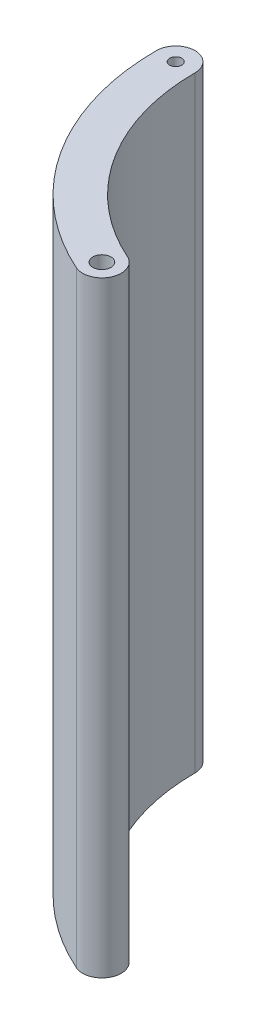
ISO-10303-21;
HEADER;
FILE_DESCRIPTION(('STEP AP214'),'2;1');
FILE_NAME('part.step','',(''),(''),'','','');
FILE_SCHEMA(('AUTOMOTIVE_DESIGN { 1 0 10303 214 1 1 1 1 }'));
ENDSEC;
DATA;
#1=APPLICATION_CONTEXT('core data for automotive mechanical design processes');
#2=APPLICATION_PROTOCOL_DEFINITION('international standard','automotive_design',2000,#1);
#3=PRODUCT_CONTEXT('',#1,'mechanical');
#4=PRODUCT('Part','Part','',(#3));
#5=PRODUCT_RELATED_PRODUCT_CATEGORY('part','',(#4));
#6=PRODUCT_DEFINITION_FORMATION('','',#4);
#7=PRODUCT_DEFINITION_CONTEXT('part definition',#1,'design');
#8=PRODUCT_DEFINITION('design','',#6,#7);
#9=PRODUCT_DEFINITION_SHAPE('','',#8);
#10=(LENGTH_UNIT() NAMED_UNIT(*) SI_UNIT(.MILLI.,.METRE.));
#11=(NAMED_UNIT(*) PLANE_ANGLE_UNIT() SI_UNIT($,.RADIAN.));
#12=(NAMED_UNIT(*) SI_UNIT($,.STERADIAN.) SOLID_ANGLE_UNIT());
#13=UNCERTAINTY_MEASURE_WITH_UNIT(LENGTH_MEASURE(1.E-05),#10,'distance_accuracy_value','');
#14=(GEOMETRIC_REPRESENTATION_CONTEXT(3) GLOBAL_UNCERTAINTY_ASSIGNED_CONTEXT((#13)) GLOBAL_UNIT_ASSIGNED_CONTEXT((#10,
#11,#12)) REPRESENTATION_CONTEXT('',''));
#15=CARTESIAN_POINT('',(0.,0.,0.));
#16=DIRECTION('',(0.,0.,1.));
#17=DIRECTION('',(1.,0.,0.));
#18=AXIS2_PLACEMENT_3D('',#15,#16,#17);
#19=CARTESIAN_POINT('',(-19.,100.,0.));
#20=DIRECTION('',(0.,-1.,0.));
#21=DIRECTION('',(0.,0.,-1.));
#22=AXIS2_PLACEMENT_3D('',#19,#20,#21);
#23=PLANE('',#22);
#24=CARTESIAN_POINT('',(-38.,100.,0.));
#25=DIRECTION('',(0.,1.,0.));
#26=DIRECTION('',(0.,0.,-1.));
#27=AXIS2_PLACEMENT_3D('',#24,#25,#26);
#28=CIRCLE('',#27,3.18);
#29=CARTESIAN_POINT('',(-34.82,100.,0.));
#30=VERTEX_POINT('',#29);
#31=CARTESIAN_POINT('',(-41.18,100.,0.));
#32=VERTEX_POINT('',#31);
#33=EDGE_CURVE('E92',#30,#32,#28,.T.);
#34=ORIENTED_EDGE('',*,*,#33,.T.);
#35=CARTESIAN_POINT('',(0.,100.,0.));
#36=DIRECTION('',(0.,1.,0.));
#37=DIRECTION('',(0.,0.,1.));
#38=AXIS2_PLACEMENT_3D('',#35,#36,#37);
#39=CIRCLE('',#38,41.18);
#40=CARTESIAN_POINT('',(-16.7494149618614,100.,37.6198019457224));
#41=VERTEX_POINT('',#40);
#42=EDGE_CURVE('E87',#32,#41,#39,.T.);
#43=ORIENTED_EDGE('',*,*,#42,.T.);
#44=CARTESIAN_POINT('',(-15.4559924368803,100.,34.7147273904189));
#45=DIRECTION('',(0.,1.,0.));
#46=DIRECTION('',(0.,0.,-1.));
#47=AXIS2_PLACEMENT_3D('',#44,#45,#46);
#48=CIRCLE('',#47,3.18);
#49=CARTESIAN_POINT('',(-14.1625699118993,100.,31.8096528351154));
#50=VERTEX_POINT('',#49);
#51=EDGE_CURVE('E90',#41,#50,#48,.T.);
#52=ORIENTED_EDGE('',*,*,#51,.T.);
#53=CARTESIAN_POINT('',(0.,100.,0.));
#54=DIRECTION('',(0.,-1.,0.));
#55=DIRECTION('',(0.,0.,1.));
#56=AXIS2_PLACEMENT_3D('',#53,#54,#55);
#57=CIRCLE('',#56,34.82);
#58=EDGE_CURVE('E57',#50,#30,#57,.T.);
#59=ORIENTED_EDGE('',*,*,#58,.T.);
#60=EDGE_LOOP('',(#34,#43,#52,#59));
#61=FACE_BOUND('',#60,.T.);
#62=CARTESIAN_POINT('',(-15.4559924368803,100.,34.7147273904189));
#63=DIRECTION('',(0.,1.,0.));
#64=DIRECTION('',(0.,0.,1.));
#65=AXIS2_PLACEMENT_3D('',#62,#63,#64);
#66=CIRCLE('',#65,1.5);
#67=CARTESIAN_POINT('',(-15.4559924368803,100.,36.2147273904189));
#68=VERTEX_POINT('',#67);
#69=EDGE_CURVE('E112',#68,#68,#66,.T.);
#70=ORIENTED_EDGE('',*,*,#69,.F.);
#71=EDGE_LOOP('',(#70));
#72=FACE_BOUND('',#71,.T.);
#73=CARTESIAN_POINT('',(-38.,100.,0.));
#74=DIRECTION('',(0.,1.,0.));
#75=DIRECTION('',(0.,0.,1.));
#76=AXIS2_PLACEMENT_3D('',#73,#74,#75);
#77=CIRCLE('',#76,0.999999999999998);
#78=CARTESIAN_POINT('',(-38.,100.,0.999999999999998));
#79=VERTEX_POINT('',#78);
#80=EDGE_CURVE('E134',#79,#79,#77,.T.);
#81=ORIENTED_EDGE('',*,*,#80,.F.);
#82=EDGE_LOOP('',(#81));
#83=FACE_BOUND('',#82,.T.);
#84=ADVANCED_FACE('F39',(#61,#72,#83),#23,.F.);
#85=CARTESIAN_POINT('',(-19.,0.,0.));
#86=DIRECTION('',(0.,-1.,0.));
#87=DIRECTION('',(0.,0.,-1.));
#88=AXIS2_PLACEMENT_3D('',#85,#86,#87);
#89=PLANE('',#88);
#90=CARTESIAN_POINT('',(-15.4559924368803,0.,34.7147273904189));
#91=DIRECTION('',(0.,1.,0.));
#92=DIRECTION('',(0.,0.,1.));
#93=AXIS2_PLACEMENT_3D('',#90,#91,#92);
#94=CIRCLE('',#93,1.5);
#95=CARTESIAN_POINT('',(-15.4559924368803,0.,36.2147273904189));
#96=VERTEX_POINT('',#95);
#97=EDGE_CURVE('E130',#96,#96,#94,.T.);
#98=ORIENTED_EDGE('',*,*,#97,.T.);
#99=EDGE_LOOP('',(#98));
#100=FACE_BOUND('',#99,.T.);
#101=CARTESIAN_POINT('',(-38.,0.,0.));
#102=DIRECTION('',(0.,1.,0.));
#103=DIRECTION('',(0.,0.,-1.));
#104=AXIS2_PLACEMENT_3D('',#101,#102,#103);
#105=CIRCLE('',#104,3.18);
#106=CARTESIAN_POINT('',(-34.82,0.,0.));
#107=VERTEX_POINT('',#106);
#108=CARTESIAN_POINT('',(-41.18,0.,0.));
#109=VERTEX_POINT('',#108);
#110=EDGE_CURVE('E108',#107,#109,#105,.T.);
#111=ORIENTED_EDGE('',*,*,#110,.F.);
#112=CARTESIAN_POINT('',(0.,0.,0.));
#113=DIRECTION('',(0.,-1.,0.));
#114=DIRECTION('',(0.,0.,1.));
#115=AXIS2_PLACEMENT_3D('',#112,#113,#114);
#116=CIRCLE('',#115,34.82);
#117=CARTESIAN_POINT('',(-14.1625699118993,0.,31.8096528351154));
#118=VERTEX_POINT('',#117);
#119=EDGE_CURVE('E80',#118,#107,#116,.T.);
#120=ORIENTED_EDGE('',*,*,#119,.F.);
#121=CARTESIAN_POINT('',(-15.4559924368803,0.,34.7147273904189));
#122=DIRECTION('',(0.,1.,0.));
#123=DIRECTION('',(0.,0.,-1.));
#124=AXIS2_PLACEMENT_3D('',#121,#122,#123);
#125=CIRCLE('',#124,3.18);
#126=CARTESIAN_POINT('',(-16.7494149618614,0.,37.6198019457224));
#127=VERTEX_POINT('',#126);
#128=EDGE_CURVE('E74',#127,#118,#125,.T.);
#129=ORIENTED_EDGE('',*,*,#128,.F.);
#130=CARTESIAN_POINT('',(0.,0.,0.));
#131=DIRECTION('',(0.,1.,0.));
#132=DIRECTION('',(0.,0.,1.));
#133=AXIS2_PLACEMENT_3D('',#130,#131,#132);
#134=CIRCLE('',#133,41.18);
#135=EDGE_CURVE('E97',#109,#127,#134,.T.);
#136=ORIENTED_EDGE('',*,*,#135,.F.);
#137=EDGE_LOOP('',(#111,#120,#129,#136));
#138=FACE_BOUND('',#137,.T.);
#139=CARTESIAN_POINT('',(-38.,0.,0.));
#140=DIRECTION('',(0.,1.,0.));
#141=DIRECTION('',(0.,0.,1.));
#142=AXIS2_PLACEMENT_3D('',#139,#140,#141);
#143=CIRCLE('',#142,0.999999999999998);
#144=CARTESIAN_POINT('',(-38.,0.,0.999999999999998));
#145=VERTEX_POINT('',#144);
#146=EDGE_CURVE('E138',#145,#145,#143,.T.);
#147=ORIENTED_EDGE('',*,*,#146,.T.);
#148=EDGE_LOOP('',(#147));
#149=FACE_BOUND('',#148,.T.);
#150=ADVANCED_FACE('F125',(#100,#138,#149),#89,.T.);
#151=CARTESIAN_POINT('',(-38.,100.,0.));
#152=DIRECTION('',(0.,-1.,0.));
#153=DIRECTION('',(0.,0.,-1.));
#154=AXIS2_PLACEMENT_3D('',#151,#152,#153);
#155=CYLINDRICAL_SURFACE('',#154,3.18);
#156=ORIENTED_EDGE('',*,*,#110,.T.);
#157=DIRECTION('',(0.,-1.,0.));
#158=VECTOR('',#157,1.);
#159=CARTESIAN_POINT('',(-41.18,100.,0.));
#160=LINE('',#159,#158);
#161=EDGE_CURVE('E11',#32,#109,#160,.T.);
#162=ORIENTED_EDGE('',*,*,#161,.F.);
#163=ORIENTED_EDGE('',*,*,#33,.F.);
#164=DIRECTION('',(0.,-1.,0.));
#165=VECTOR('',#164,1.);
#166=CARTESIAN_POINT('',(-34.82,100.,0.));
#167=LINE('',#166,#165);
#168=EDGE_CURVE('E104',#30,#107,#167,.T.);
#169=ORIENTED_EDGE('',*,*,#168,.T.);
#170=EDGE_LOOP('',(#156,#162,#163,#169));
#171=FACE_BOUND('',#170,.T.);
#172=ADVANCED_FACE('F41',(#171),#155,.T.);
#173=CARTESIAN_POINT('',(0.,100.,0.));
#174=DIRECTION('',(0.,-1.,0.));
#175=DIRECTION('',(0.,0.,-1.));
#176=AXIS2_PLACEMENT_3D('',#173,#174,#175);
#177=CYLINDRICAL_SURFACE('',#176,41.18);
#178=ORIENTED_EDGE('',*,*,#135,.T.);
#179=DIRECTION('',(0.,-1.,0.));
#180=VECTOR('',#179,1.);
#181=CARTESIAN_POINT('',(-16.7494149618614,100.,37.6198019457224));
#182=LINE('',#181,#180);
#183=EDGE_CURVE('E49',#41,#127,#182,.T.);
#184=ORIENTED_EDGE('',*,*,#183,.F.);
#185=ORIENTED_EDGE('',*,*,#42,.F.);
#186=ORIENTED_EDGE('',*,*,#161,.T.);
#187=EDGE_LOOP('',(#178,#184,#185,#186));
#188=FACE_BOUND('',#187,.T.);
#189=ADVANCED_FACE('F96',(#188),#177,.T.);
#190=CARTESIAN_POINT('',(-15.4559924368803,100.,34.7147273904189));
#191=DIRECTION('',(0.,-1.,0.));
#192=DIRECTION('',(0.,0.,-1.));
#193=AXIS2_PLACEMENT_3D('',#190,#191,#192);
#194=CYLINDRICAL_SURFACE('',#193,3.18);
#195=ORIENTED_EDGE('',*,*,#128,.T.);
#196=DIRECTION('',(0.,-1.,0.));
#197=VECTOR('',#196,1.);
#198=CARTESIAN_POINT('',(-14.1625699118993,100.,31.8096528351154));
#199=LINE('',#198,#197);
#200=EDGE_CURVE('E99',#50,#118,#199,.T.);
#201=ORIENTED_EDGE('',*,*,#200,.F.);
#202=ORIENTED_EDGE('',*,*,#51,.F.);
#203=ORIENTED_EDGE('',*,*,#183,.T.);
#204=EDGE_LOOP('',(#195,#201,#202,#203));
#205=FACE_BOUND('',#204,.T.);
#206=ADVANCED_FACE('F100',(#205),#194,.T.);
#207=CARTESIAN_POINT('',(0.,100.,0.));
#208=DIRECTION('',(0.,-1.,0.));
#209=DIRECTION('',(0.,0.,-1.));
#210=AXIS2_PLACEMENT_3D('',#207,#208,#209);
#211=CYLINDRICAL_SURFACE('',#210,34.82);
#212=ORIENTED_EDGE('',*,*,#119,.T.);
#213=ORIENTED_EDGE('',*,*,#168,.F.);
#214=ORIENTED_EDGE('',*,*,#58,.F.);
#215=ORIENTED_EDGE('',*,*,#200,.T.);
#216=EDGE_LOOP('',(#212,#213,#214,#215));
#217=FACE_BOUND('',#216,.T.);
#218=ADVANCED_FACE('F122',(#217),#211,.F.);
#219=CARTESIAN_POINT('',(-15.4559924368803,100.,34.7147273904189));
#220=DIRECTION('',(0.,-1.,0.));
#221=DIRECTION('',(0.,0.,-1.));
#222=AXIS2_PLACEMENT_3D('',#219,#220,#221);
#223=CYLINDRICAL_SURFACE('',#222,1.5);
#224=ORIENTED_EDGE('',*,*,#69,.T.);
#225=EDGE_LOOP('',(#224));
#226=FACE_BOUND('',#225,.T.);
#227=ORIENTED_EDGE('',*,*,#97,.F.);
#228=EDGE_LOOP('',(#227));
#229=FACE_BOUND('',#228,.T.);
#230=ADVANCED_FACE('F157',(#226,#229),#223,.F.);
#231=CARTESIAN_POINT('',(-38.,100.,0.));
#232=DIRECTION('',(0.,-1.,0.));
#233=DIRECTION('',(0.,0.,-1.));
#234=AXIS2_PLACEMENT_3D('',#231,#232,#233);
#235=CYLINDRICAL_SURFACE('',#234,0.999999999999998);
#236=ORIENTED_EDGE('',*,*,#80,.T.);
#237=EDGE_LOOP('',(#236));
#238=FACE_BOUND('',#237,.T.);
#239=ORIENTED_EDGE('',*,*,#146,.F.);
#240=EDGE_LOOP('',(#239));
#241=FACE_BOUND('',#240,.T.);
#242=ADVANCED_FACE('F146',(#238,#241),#235,.F.);
#243=CLOSED_SHELL('',(#84,#150,#172,#189,#206,#218,#230,#242));
#244=MANIFOLD_SOLID_BREP('B2',#243);
#245=ADVANCED_BREP_SHAPE_REPRESENTATION('',(#18,#244),#14);
#246=SHAPE_DEFINITION_REPRESENTATION(#9,#245);
ENDSEC;
END-ISO-10303-21;
